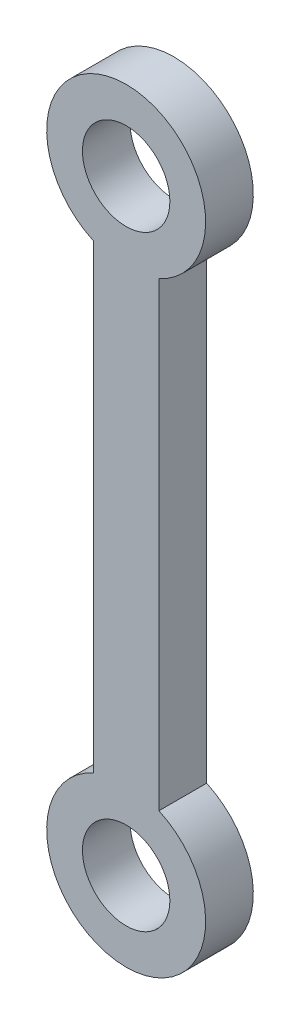
ISO-10303-21;
HEADER;
FILE_DESCRIPTION(('STEP AP214'),'2;1');
FILE_NAME('part.step','',(''),(''),'','','');
FILE_SCHEMA(('AUTOMOTIVE_DESIGN { 1 0 10303 214 1 1 1 1 }'));
ENDSEC;
DATA;
#1=APPLICATION_CONTEXT('core data for automotive mechanical design processes');
#2=APPLICATION_PROTOCOL_DEFINITION('international standard','automotive_design',2000,#1);
#3=PRODUCT_CONTEXT('',#1,'mechanical');
#4=PRODUCT('Part','Part','',(#3));
#5=PRODUCT_RELATED_PRODUCT_CATEGORY('part','',(#4));
#6=PRODUCT_DEFINITION_FORMATION('','',#4);
#7=PRODUCT_DEFINITION_CONTEXT('part definition',#1,'design');
#8=PRODUCT_DEFINITION('design','',#6,#7);
#9=PRODUCT_DEFINITION_SHAPE('','',#8);
#10=(LENGTH_UNIT() NAMED_UNIT(*) SI_UNIT(.MILLI.,.METRE.));
#11=(NAMED_UNIT(*) PLANE_ANGLE_UNIT() SI_UNIT($,.RADIAN.));
#12=(NAMED_UNIT(*) SI_UNIT($,.STERADIAN.) SOLID_ANGLE_UNIT());
#13=UNCERTAINTY_MEASURE_WITH_UNIT(LENGTH_MEASURE(1.E-05),#10,'distance_accuracy_value','');
#14=(GEOMETRIC_REPRESENTATION_CONTEXT(3) GLOBAL_UNCERTAINTY_ASSIGNED_CONTEXT((#13)) GLOBAL_UNIT_ASSIGNED_CONTEXT((#10,
#11,#12)) REPRESENTATION_CONTEXT('',''));
#15=CARTESIAN_POINT('',(0.,0.,0.));
#16=DIRECTION('',(0.,0.,1.));
#17=DIRECTION('',(1.,0.,0.));
#18=AXIS2_PLACEMENT_3D('',#15,#16,#17);
#19=CARTESIAN_POINT('',(642.687607750701,-1296.13673865925,1.5));
#20=DIRECTION('',(0.,0.,1.));
#21=DIRECTION('',(1.,0.,0.));
#22=AXIS2_PLACEMENT_3D('',#19,#20,#21);
#23=PLANE('',#22);
#24=CARTESIAN_POINT('',(642.687607750701,-1296.13673865925,1.5));
#25=DIRECTION('',(0.,0.,1.));
#26=DIRECTION('',(1.,0.,0.));
#27=AXIS2_PLACEMENT_3D('',#24,#25,#26);
#28=CIRCLE('',#27,2.75000000000002);
#29=CARTESIAN_POINT('',(645.437607750701,-1296.13673865925,1.5));
#30=VERTEX_POINT('',#29);
#31=EDGE_CURVE('E118',#30,#30,#28,.T.);
#32=ORIENTED_EDGE('',*,*,#31,.F.);
#33=EDGE_LOOP('',(#32));
#34=FACE_BOUND('',#33,.T.);
#35=CARTESIAN_POINT('',(642.687607750701,-1296.13673865925,1.5));
#36=DIRECTION('',(0.,0.,1.));
#37=DIRECTION('',(1.,0.,0.));
#38=AXIS2_PLACEMENT_3D('',#35,#36,#37);
#39=CIRCLE('',#38,5.00000000000005);
#40=CARTESIAN_POINT('',(640.625334238876,-1291.58184810486,1.5));
#41=VERTEX_POINT('',#40);
#42=CARTESIAN_POINT('',(644.749881262525,-1291.58184810486,1.5));
#43=VERTEX_POINT('',#42);
#44=EDGE_CURVE('E98',#41,#43,#39,.T.);
#45=ORIENTED_EDGE('',*,*,#44,.T.);
#46=DIRECTION('',(0.,1.,0.));
#47=VECTOR('',#46,1.);
#48=CARTESIAN_POINT('',(644.749881262525,-1262.59162921363,1.5));
#49=LINE('',#48,#47);
#50=CARTESIAN_POINT('',(644.749881262525,-1262.59162921363,1.5));
#51=VERTEX_POINT('',#50);
#52=EDGE_CURVE('E93',#43,#51,#49,.T.);
#53=ORIENTED_EDGE('',*,*,#52,.T.);
#54=CARTESIAN_POINT('',(642.687607750701,-1258.03673865925,1.5));
#55=DIRECTION('',(0.,0.,1.));
#56=DIRECTION('',(1.,0.,0.));
#57=AXIS2_PLACEMENT_3D('',#54,#55,#56);
#58=CIRCLE('',#57,5.00000000000005);
#59=CARTESIAN_POINT('',(640.625334238876,-1262.59162921363,1.5));
#60=VERTEX_POINT('',#59);
#61=EDGE_CURVE('E96',#51,#60,#58,.T.);
#62=ORIENTED_EDGE('',*,*,#61,.T.);
#63=DIRECTION('',(0.,-1.,0.));
#64=VECTOR('',#63,1.);
#65=CARTESIAN_POINT('',(640.625334238876,-1262.59162921363,1.5));
#66=LINE('',#65,#64);
#67=EDGE_CURVE('E63',#60,#41,#66,.T.);
#68=ORIENTED_EDGE('',*,*,#67,.T.);
#69=EDGE_LOOP('',(#45,#53,#62,#68));
#70=FACE_BOUND('',#69,.T.);
#71=CARTESIAN_POINT('',(642.687607750701,-1258.03673865925,1.5));
#72=DIRECTION('',(0.,0.,1.));
#73=DIRECTION('',(1.,0.,0.));
#74=AXIS2_PLACEMENT_3D('',#71,#72,#73);
#75=CIRCLE('',#74,2.75000000000002);
#76=CARTESIAN_POINT('',(645.437607750701,-1258.03673865925,1.5));
#77=VERTEX_POINT('',#76);
#78=EDGE_CURVE('E140',#77,#77,#75,.T.);
#79=ORIENTED_EDGE('',*,*,#78,.F.);
#80=EDGE_LOOP('',(#79));
#81=FACE_BOUND('',#80,.T.);
#82=ADVANCED_FACE('F45',(#34,#70,#81),#23,.T.);
#83=CARTESIAN_POINT('',(642.687607750701,-1296.13673865925,-1.5));
#84=DIRECTION('',(0.,0.,1.));
#85=DIRECTION('',(1.,0.,0.));
#86=AXIS2_PLACEMENT_3D('',#83,#84,#85);
#87=PLANE('',#86);
#88=CARTESIAN_POINT('',(642.687607750701,-1296.13673865925,-1.5));
#89=DIRECTION('',(0.,0.,1.));
#90=DIRECTION('',(1.,0.,0.));
#91=AXIS2_PLACEMENT_3D('',#88,#89,#90);
#92=CIRCLE('',#91,5.00000000000005);
#93=CARTESIAN_POINT('',(640.625334238876,-1291.58184810486,-1.5));
#94=VERTEX_POINT('',#93);
#95=CARTESIAN_POINT('',(644.749881262525,-1291.58184810486,-1.5));
#96=VERTEX_POINT('',#95);
#97=EDGE_CURVE('E114',#94,#96,#92,.T.);
#98=ORIENTED_EDGE('',*,*,#97,.F.);
#99=DIRECTION('',(0.,-1.,0.));
#100=VECTOR('',#99,1.);
#101=CARTESIAN_POINT('',(640.625334238876,-1262.59162921363,-1.5));
#102=LINE('',#101,#100);
#103=CARTESIAN_POINT('',(640.625334238876,-1262.59162921363,-1.5));
#104=VERTEX_POINT('',#103);
#105=EDGE_CURVE('E86',#104,#94,#102,.T.);
#106=ORIENTED_EDGE('',*,*,#105,.F.);
#107=CARTESIAN_POINT('',(642.687607750701,-1258.03673865925,-1.5));
#108=DIRECTION('',(0.,0.,1.));
#109=DIRECTION('',(1.,0.,0.));
#110=AXIS2_PLACEMENT_3D('',#107,#108,#109);
#111=CIRCLE('',#110,5.00000000000005);
#112=CARTESIAN_POINT('',(644.749881262525,-1262.59162921363,-1.5));
#113=VERTEX_POINT('',#112);
#114=EDGE_CURVE('E80',#113,#104,#111,.T.);
#115=ORIENTED_EDGE('',*,*,#114,.F.);
#116=DIRECTION('',(0.,1.,0.));
#117=VECTOR('',#116,1.);
#118=CARTESIAN_POINT('',(644.749881262525,-1262.59162921363,-1.5));
#119=LINE('',#118,#117);
#120=EDGE_CURVE('E103',#96,#113,#119,.T.);
#121=ORIENTED_EDGE('',*,*,#120,.F.);
#122=EDGE_LOOP('',(#98,#106,#115,#121));
#123=FACE_BOUND('',#122,.T.);
#124=CARTESIAN_POINT('',(642.687607750701,-1296.13673865925,-1.5));
#125=DIRECTION('',(0.,0.,1.));
#126=DIRECTION('',(1.,0.,0.));
#127=AXIS2_PLACEMENT_3D('',#124,#125,#126);
#128=CIRCLE('',#127,2.75000000000002);
#129=CARTESIAN_POINT('',(645.437607750701,-1296.13673865925,-1.5));
#130=VERTEX_POINT('',#129);
#131=EDGE_CURVE('E136',#130,#130,#128,.T.);
#132=ORIENTED_EDGE('',*,*,#131,.T.);
#133=EDGE_LOOP('',(#132));
#134=FACE_BOUND('',#133,.T.);
#135=CARTESIAN_POINT('',(642.687607750701,-1258.03673865925,-1.5));
#136=DIRECTION('',(0.,0.,1.));
#137=DIRECTION('',(1.,0.,0.));
#138=AXIS2_PLACEMENT_3D('',#135,#136,#137);
#139=CIRCLE('',#138,2.75000000000002);
#140=CARTESIAN_POINT('',(645.437607750701,-1258.03673865925,-1.5));
#141=VERTEX_POINT('',#140);
#142=EDGE_CURVE('E144',#141,#141,#139,.T.);
#143=ORIENTED_EDGE('',*,*,#142,.T.);
#144=EDGE_LOOP('',(#143));
#145=FACE_BOUND('',#144,.T.);
#146=ADVANCED_FACE('F131',(#123,#134,#145),#87,.F.);
#147=CARTESIAN_POINT('',(642.687607750701,-1296.13673865925,1.5));
#148=DIRECTION('',(0.,0.,-1.));
#149=DIRECTION('',(-1.,0.,0.));
#150=AXIS2_PLACEMENT_3D('',#147,#148,#149);
#151=CYLINDRICAL_SURFACE('',#150,5.00000000000005);
#152=ORIENTED_EDGE('',*,*,#97,.T.);
#153=DIRECTION('',(0.,0.,-1.));
#154=VECTOR('',#153,1.);
#155=CARTESIAN_POINT('',(644.749881262525,-1291.58184810486,1.5));
#156=LINE('',#155,#154);
#157=EDGE_CURVE('E11',#43,#96,#156,.T.);
#158=ORIENTED_EDGE('',*,*,#157,.F.);
#159=ORIENTED_EDGE('',*,*,#44,.F.);
#160=DIRECTION('',(0.,0.,-1.));
#161=VECTOR('',#160,1.);
#162=CARTESIAN_POINT('',(640.625334238876,-1291.58184810486,1.5));
#163=LINE('',#162,#161);
#164=EDGE_CURVE('E110',#41,#94,#163,.T.);
#165=ORIENTED_EDGE('',*,*,#164,.T.);
#166=EDGE_LOOP('',(#152,#158,#159,#165));
#167=FACE_BOUND('',#166,.T.);
#168=ADVANCED_FACE('F47',(#167),#151,.T.);
#169=CARTESIAN_POINT('',(644.749881262525,-1262.59162921363,1.5));
#170=DIRECTION('',(-1.,0.,0.));
#171=DIRECTION('',(0.,0.,1.));
#172=AXIS2_PLACEMENT_3D('',#169,#170,#171);
#173=PLANE('',#172);
#174=ORIENTED_EDGE('',*,*,#120,.T.);
#175=DIRECTION('',(0.,0.,-1.));
#176=VECTOR('',#175,1.);
#177=CARTESIAN_POINT('',(644.749881262525,-1262.59162921363,1.5));
#178=LINE('',#177,#176);
#179=EDGE_CURVE('E55',#51,#113,#178,.T.);
#180=ORIENTED_EDGE('',*,*,#179,.F.);
#181=ORIENTED_EDGE('',*,*,#52,.F.);
#182=ORIENTED_EDGE('',*,*,#157,.T.);
#183=EDGE_LOOP('',(#174,#180,#181,#182));
#184=FACE_BOUND('',#183,.T.);
#185=ADVANCED_FACE('F102',(#184),#173,.F.);
#186=CARTESIAN_POINT('',(642.687607750701,-1258.03673865925,1.5));
#187=DIRECTION('',(0.,0.,-1.));
#188=DIRECTION('',(-1.,0.,0.));
#189=AXIS2_PLACEMENT_3D('',#186,#187,#188);
#190=CYLINDRICAL_SURFACE('',#189,5.00000000000005);
#191=ORIENTED_EDGE('',*,*,#114,.T.);
#192=DIRECTION('',(0.,0.,-1.));
#193=VECTOR('',#192,1.);
#194=CARTESIAN_POINT('',(640.625334238876,-1262.59162921363,1.5));
#195=LINE('',#194,#193);
#196=EDGE_CURVE('E105',#60,#104,#195,.T.);
#197=ORIENTED_EDGE('',*,*,#196,.F.);
#198=ORIENTED_EDGE('',*,*,#61,.F.);
#199=ORIENTED_EDGE('',*,*,#179,.T.);
#200=EDGE_LOOP('',(#191,#197,#198,#199));
#201=FACE_BOUND('',#200,.T.);
#202=ADVANCED_FACE('F106',(#201),#190,.T.);
#203=CARTESIAN_POINT('',(640.625334238876,-1262.59162921363,1.5));
#204=DIRECTION('',(1.,0.,0.));
#205=DIRECTION('',(0.,0.,-1.));
#206=AXIS2_PLACEMENT_3D('',#203,#204,#205);
#207=PLANE('',#206);
#208=ORIENTED_EDGE('',*,*,#105,.T.);
#209=ORIENTED_EDGE('',*,*,#164,.F.);
#210=ORIENTED_EDGE('',*,*,#67,.F.);
#211=ORIENTED_EDGE('',*,*,#196,.T.);
#212=EDGE_LOOP('',(#208,#209,#210,#211));
#213=FACE_BOUND('',#212,.T.);
#214=ADVANCED_FACE('F128',(#213),#207,.F.);
#215=CARTESIAN_POINT('',(642.687607750701,-1296.13673865925,1.5));
#216=DIRECTION('',(0.,0.,-1.));
#217=DIRECTION('',(-1.,0.,0.));
#218=AXIS2_PLACEMENT_3D('',#215,#216,#217);
#219=CYLINDRICAL_SURFACE('',#218,2.75000000000002);
#220=ORIENTED_EDGE('',*,*,#31,.T.);
#221=EDGE_LOOP('',(#220));
#222=FACE_BOUND('',#221,.T.);
#223=ORIENTED_EDGE('',*,*,#131,.F.);
#224=EDGE_LOOP('',(#223));
#225=FACE_BOUND('',#224,.T.);
#226=ADVANCED_FACE('F163',(#222,#225),#219,.F.);
#227=CARTESIAN_POINT('',(642.687607750701,-1258.03673865925,1.5));
#228=DIRECTION('',(0.,0.,-1.));
#229=DIRECTION('',(-1.,0.,0.));
#230=AXIS2_PLACEMENT_3D('',#227,#228,#229);
#231=CYLINDRICAL_SURFACE('',#230,2.75000000000002);
#232=ORIENTED_EDGE('',*,*,#78,.T.);
#233=EDGE_LOOP('',(#232));
#234=FACE_BOUND('',#233,.T.);
#235=ORIENTED_EDGE('',*,*,#142,.F.);
#236=EDGE_LOOP('',(#235));
#237=FACE_BOUND('',#236,.T.);
#238=ADVANCED_FACE('F152',(#234,#237),#231,.F.);
#239=CLOSED_SHELL('',(#82,#146,#168,#185,#202,#214,#226,#238));
#240=MANIFOLD_SOLID_BREP('B2',#239);
#241=ADVANCED_BREP_SHAPE_REPRESENTATION('',(#18,#240),#14);
#242=SHAPE_DEFINITION_REPRESENTATION(#9,#241);
ENDSEC;
END-ISO-10303-21;
